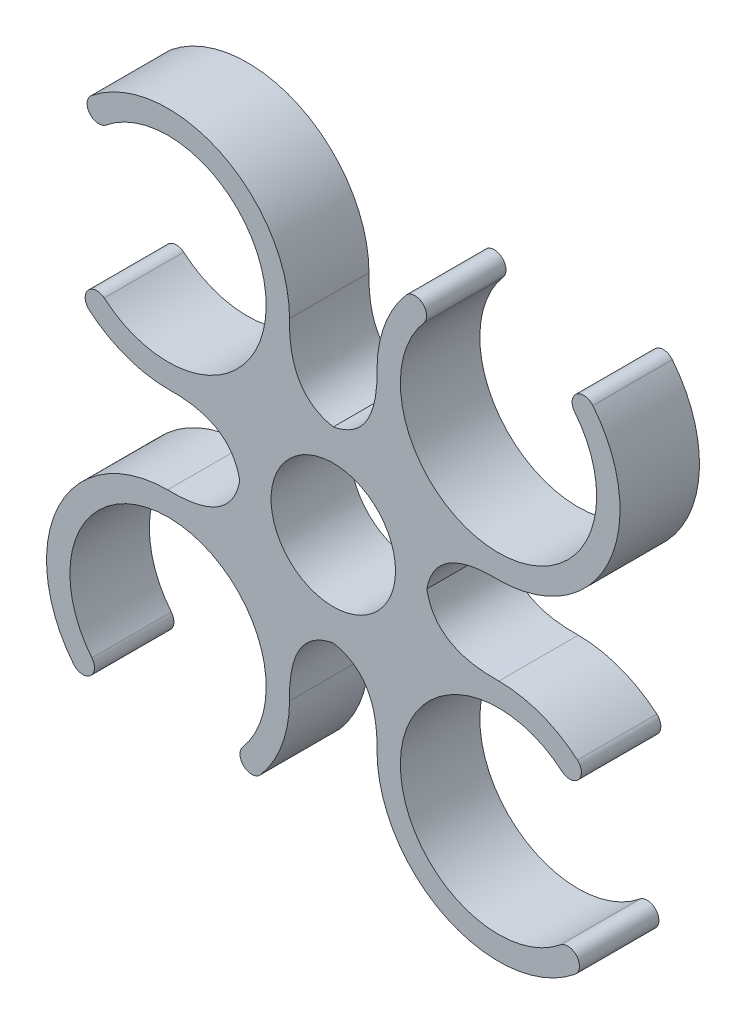
ISO-10303-21;
HEADER;
FILE_DESCRIPTION(('STEP AP214'),'2;1');
FILE_NAME('part.step','',(''),(''),'','','');
FILE_SCHEMA(('AUTOMOTIVE_DESIGN { 1 0 10303 214 1 1 1 1 }'));
ENDSEC;
DATA;
#1=APPLICATION_CONTEXT('core data for automotive mechanical design processes');
#2=APPLICATION_PROTOCOL_DEFINITION('international standard','automotive_design',2000,#1);
#3=PRODUCT_CONTEXT('',#1,'mechanical');
#4=PRODUCT('Part','Part','',(#3));
#5=PRODUCT_RELATED_PRODUCT_CATEGORY('part','',(#4));
#6=PRODUCT_DEFINITION_FORMATION('','',#4);
#7=PRODUCT_DEFINITION_CONTEXT('part definition',#1,'design');
#8=PRODUCT_DEFINITION('design','',#6,#7);
#9=PRODUCT_DEFINITION_SHAPE('','',#8);
#10=(LENGTH_UNIT() NAMED_UNIT(*) SI_UNIT(.MILLI.,.METRE.));
#11=(NAMED_UNIT(*) PLANE_ANGLE_UNIT() SI_UNIT($,.RADIAN.));
#12=(NAMED_UNIT(*) SI_UNIT($,.STERADIAN.) SOLID_ANGLE_UNIT());
#13=UNCERTAINTY_MEASURE_WITH_UNIT(LENGTH_MEASURE(1.E-05),#10,'distance_accuracy_value','');
#14=(GEOMETRIC_REPRESENTATION_CONTEXT(3) GLOBAL_UNCERTAINTY_ASSIGNED_CONTEXT((#13)) GLOBAL_UNIT_ASSIGNED_CONTEXT((#10,
#11,#12)) REPRESENTATION_CONTEXT('',''));
#15=CARTESIAN_POINT('',(0.,0.,0.));
#16=DIRECTION('',(0.,0.,1.));
#17=DIRECTION('',(1.,0.,0.));
#18=AXIS2_PLACEMENT_3D('',#15,#16,#17);
#19=CARTESIAN_POINT('',(-28.7157999497946,42.0002896032631,17.));
#20=DIRECTION('',(0.,0.,1.));
#21=DIRECTION('',(1.,0.,0.));
#22=AXIS2_PLACEMENT_3D('',#19,#20,#21);
#23=PLANE('',#22);
#24=CARTESIAN_POINT('',(-28.7157999497946,42.0002896032631,17.));
#25=DIRECTION('',(0.,0.,-1.));
#26=DIRECTION('',(1.,0.,0.));
#27=AXIS2_PLACEMENT_3D('',#24,#25,#26);
#28=CIRCLE('',#27,21.0000109295997);
#29=CARTESIAN_POINT('',(-41.970273906066,58.2889168991966,17.));
#30=VERTEX_POINT('',#29);
#31=CARTESIAN_POINT('',(-42.3689498491305,26.04435162176,17.));
#32=VERTEX_POINT('',#31);
#33=EDGE_CURVE('E154',#30,#32,#28,.T.);
#34=ORIENTED_EDGE('',*,*,#33,.T.);
#35=CARTESIAN_POINT('',(-43.9425329497987,24.1006773923868,17.));
#36=DIRECTION('',(0.,0.,1.));
#37=DIRECTION('',(-1.,0.,0.));
#38=AXIS2_PLACEMENT_3D('',#35,#36,#37);
#39=CIRCLE('',#38,2.50080652683053);
#40=CARTESIAN_POINT('',(-45.5981989573738,22.2264299818249,17.));
#41=VERTEX_POINT('',#40);
#42=EDGE_CURVE('E623',#32,#41,#39,.T.);
#43=ORIENTED_EDGE('',*,*,#42,.T.);
#44=CARTESIAN_POINT('',(-28.7157999497946,42.0002896032631,17.));
#45=DIRECTION('',(0.,0.,1.));
#46=DIRECTION('',(-1.,0.,0.));
#47=AXIS2_PLACEMENT_3D('',#44,#45,#46);
#48=CIRCLE('',#47,26.0004023157231);
#49=CARTESIAN_POINT('',(-28.7961970319889,16.0000115876605,17.));
#50=VERTEX_POINT('',#49);
#51=EDGE_CURVE('E428',#41,#50,#48,.T.);
#52=ORIENTED_EDGE('',*,*,#51,.T.);
#53=CARTESIAN_POINT('',(-28.7961970319889,16.0000115876605,17.));
#54=CARTESIAN_POINT('',(-15.2077646952023,16.3192303259778,17.));
#55=CARTESIAN_POINT('',(-13.3737129786052,6.64206558705883,17.));
#56=B_SPLINE_CURVE_WITH_KNOTS('',2,(#53,#54,#55),.UNSPECIFIED.,.F.,.F.,(3,3),(0.,1.),.UNSPECIFIED.);
#57=CARTESIAN_POINT('',(-13.3737129786052,6.64206558705883,17.));
#58=VERTEX_POINT('',#57);
#59=EDGE_CURVE('E447',#50,#58,#56,.T.);
#60=ORIENTED_EDGE('',*,*,#59,.T.);
#61=CARTESIAN_POINT('',(-13.3737129786052,6.64206558705883,17.));
#62=CARTESIAN_POINT('',(-15.2076920262172,-3.03511292406953,17.));
#63=CARTESIAN_POINT('',(-28.796126759737,-2.71599622565595,17.));
#64=B_SPLINE_CURVE_WITH_KNOTS('',2,(#61,#62,#63),.UNSPECIFIED.,.F.,.F.,(3,3),(0.,1.),.UNSPECIFIED.);
#65=CARTESIAN_POINT('',(-28.7961267597367,-2.71599622565635,17.));
#66=VERTEX_POINT('',#65);
#67=EDGE_CURVE('E444',#58,#66,#64,.T.);
#68=ORIENTED_EDGE('',*,*,#67,.T.);
#69=CARTESIAN_POINT('',(-28.7162486759378,-28.7157883621349,17.));
#70=DIRECTION('',(0.,0.,1.));
#71=DIRECTION('',(1.,0.,0.));
#72=AXIS2_PLACEMENT_3D('',#69,#70,#71);
#73=CIRCLE('',#72,25.9999148392521);
#74=CARTESIAN_POINT('',(-48.8992484305323,-45.1060931962252,17.));
#75=VERTEX_POINT('',#74);
#76=EDGE_CURVE('E446',#66,#75,#73,.T.);
#77=ORIENTED_EDGE('',*,*,#76,.T.);
#78=CARTESIAN_POINT('',(-46.9585486449202,-43.5301222757684,17.));
#79=DIRECTION('',(0.,0.,1.));
#80=DIRECTION('',(-1.,0.,0.));
#81=AXIS2_PLACEMENT_3D('',#78,#79,#80);
#82=CIRCLE('',#81,2.5);
#83=CARTESIAN_POINT('',(-45.0048759718712,-41.9702623184064,17.));
#84=VERTEX_POINT('',#83);
#85=EDGE_CURVE('E449',#75,#84,#82,.T.);
#86=ORIENTED_EDGE('',*,*,#85,.T.);
#87=CARTESIAN_POINT('',(-28.7162486759378,-28.7157883621349,17.));
#88=DIRECTION('',(0.,0.,-1.));
#89=DIRECTION('',(1.,0.,0.));
#90=AXIS2_PLACEMENT_3D('',#87,#88,#89);
#91=CIRCLE('',#90,21.0000109295997);
#92=CARTESIAN_POINT('',(-12.7603106944351,-42.3689382614704,17.));
#93=VERTEX_POINT('',#92);
#94=EDGE_CURVE('E867',#84,#93,#91,.T.);
#95=ORIENTED_EDGE('',*,*,#94,.T.);
#96=CARTESIAN_POINT('',(-10.8166364650618,-43.9425213621386,17.));
#97=DIRECTION('',(0.,0.,1.));
#98=DIRECTION('',(-1.,0.,0.));
#99=AXIS2_PLACEMENT_3D('',#96,#97,#98);
#100=CIRCLE('',#99,2.50080652683053);
#101=CARTESIAN_POINT('',(-8.94238905449951,-45.5981873697141,17.));
#102=VERTEX_POINT('',#101);
#103=EDGE_CURVE('E864',#93,#102,#100,.T.);
#104=ORIENTED_EDGE('',*,*,#103,.T.);
#105=CARTESIAN_POINT('',(-28.7162486759378,-28.7157883621349,17.));
#106=DIRECTION('',(0.,0.,1.));
#107=DIRECTION('',(-1.,0.,0.));
#108=AXIS2_PLACEMENT_3D('',#105,#106,#107);
#109=CIRCLE('',#108,26.0004023157231);
#110=CARTESIAN_POINT('',(-2.71597066033554,-28.7961854443288,17.));
#111=VERTEX_POINT('',#110);
#112=EDGE_CURVE('E866',#102,#111,#109,.T.);
#113=ORIENTED_EDGE('',*,*,#112,.T.);
#114=CARTESIAN_POINT('',(-2.71597066033554,-28.7961854443288,17.));
#115=CARTESIAN_POINT('',(-3.0351893986527,-15.2077531075425,17.));
#116=CARTESIAN_POINT('',(6.6419753402659,-13.3737013909456,17.));
#117=B_SPLINE_CURVE_WITH_KNOTS('',2,(#114,#115,#116),.UNSPECIFIED.,.F.,.F.,(3,3),(0.,1.),.UNSPECIFIED.);
#118=CARTESIAN_POINT('',(6.6419753402659,-13.3737013909456,17.));
#119=VERTEX_POINT('',#118);
#120=EDGE_CURVE('E577',#111,#119,#117,.T.);
#121=ORIENTED_EDGE('',*,*,#120,.T.);
#122=CARTESIAN_POINT('',(6.6419753402659,-13.3737013909456,17.));
#123=CARTESIAN_POINT('',(16.319153851395,-15.2076804385558,17.));
#124=CARTESIAN_POINT('',(16.0000371529809,-28.7961151720769,17.));
#125=B_SPLINE_CURVE_WITH_KNOTS('',2,(#122,#123,#124),.UNSPECIFIED.,.F.,.F.,(3,3),(0.,1.),.UNSPECIFIED.);
#126=CARTESIAN_POINT('',(16.0000371529817,-28.7961151720768,17.));
#127=VERTEX_POINT('',#126);
#128=EDGE_CURVE('E571',#119,#127,#125,.T.);
#129=ORIENTED_EDGE('',*,*,#128,.T.);
#130=CARTESIAN_POINT('',(41.9998292894603,-28.7162370882779,17.));
#131=DIRECTION('',(0.,0.,1.));
#132=DIRECTION('',(1.,0.,0.));
#133=AXIS2_PLACEMENT_3D('',#130,#131,#132);
#134=CIRCLE('',#133,25.9999148392521);
#135=CARTESIAN_POINT('',(58.3901341235506,-48.8992368428723,17.));
#136=VERTEX_POINT('',#135);
#137=EDGE_CURVE('E576',#127,#136,#134,.T.);
#138=ORIENTED_EDGE('',*,*,#137,.T.);
#139=CARTESIAN_POINT('',(56.8141632030938,-46.9585370572603,17.));
#140=DIRECTION('',(0.,0.,1.));
#141=DIRECTION('',(-1.,0.,0.));
#142=AXIS2_PLACEMENT_3D('',#139,#140,#141);
#143=CIRCLE('',#142,2.5);
#144=CARTESIAN_POINT('',(55.2543032457318,-45.0048643842112,17.));
#145=VERTEX_POINT('',#144);
#146=EDGE_CURVE('E586',#136,#145,#143,.T.);
#147=ORIENTED_EDGE('',*,*,#146,.T.);
#148=CARTESIAN_POINT('',(41.9998292894603,-28.7162370882779,17.));
#149=DIRECTION('',(0.,0.,-1.));
#150=DIRECTION('',(1.,0.,0.));
#151=AXIS2_PLACEMENT_3D('',#148,#149,#150);
#152=CIRCLE('',#151,21.0000109295997);
#153=CARTESIAN_POINT('',(55.6529791887956,-12.7602991067752,17.));
#154=VERTEX_POINT('',#153);
#155=EDGE_CURVE('E588',#145,#154,#152,.T.);
#156=ORIENTED_EDGE('',*,*,#155,.T.);
#157=CARTESIAN_POINT('',(57.2265622894635,-10.8166248774017,17.));
#158=DIRECTION('',(0.,0.,1.));
#159=DIRECTION('',(-1.,0.,0.));
#160=AXIS2_PLACEMENT_3D('',#157,#158,#159);
#161=CIRCLE('',#160,2.50080652683054);
#162=CARTESIAN_POINT('',(58.8822282970394,-8.94237746683952,17.));
#163=VERTEX_POINT('',#162);
#164=EDGE_CURVE('E590',#154,#163,#161,.T.);
#165=ORIENTED_EDGE('',*,*,#164,.T.);
#166=CARTESIAN_POINT('',(41.9998292894603,-28.7162370882779,17.));
#167=DIRECTION('',(0.,0.,1.));
#168=DIRECTION('',(-1.,0.,0.));
#169=AXIS2_PLACEMENT_3D('',#166,#167,#168);
#170=CIRCLE('',#169,26.0004023157231);
#171=CARTESIAN_POINT('',(42.0802263716538,-2.71595907267545,17.));
#172=VERTEX_POINT('',#171);
#173=EDGE_CURVE('E591',#163,#172,#170,.T.);
#174=ORIENTED_EDGE('',*,*,#173,.T.);
#175=CARTESIAN_POINT('',(42.0802263716538,-2.71595907267545,17.));
#176=CARTESIAN_POINT('',(28.4917940348677,-3.03517781099263,17.));
#177=CARTESIAN_POINT('',(26.6577423182709,6.64198692792578,17.));
#178=B_SPLINE_CURVE_WITH_KNOTS('',2,(#175,#176,#177),.UNSPECIFIED.,.F.,.F.,(3,3),(0.,1.),.UNSPECIFIED.);
#179=CARTESIAN_POINT('',(26.6577423182709,6.64198692792578,17.));
#180=VERTEX_POINT('',#179);
#181=EDGE_CURVE('E523',#172,#180,#178,.T.);
#182=ORIENTED_EDGE('',*,*,#181,.T.);
#183=CARTESIAN_POINT('',(26.6577423182709,6.64198692792578,17.));
#184=CARTESIAN_POINT('',(28.4917213658809,16.3191654390547,17.));
#185=CARTESIAN_POINT('',(42.0801560994019,16.000048740641,17.));
#186=B_SPLINE_CURVE_WITH_KNOTS('',2,(#183,#184,#185),.UNSPECIFIED.,.F.,.F.,(3,3),(0.,1.),.UNSPECIFIED.);
#187=CARTESIAN_POINT('',(42.080156099402,16.0000487406416,17.));
#188=VERTEX_POINT('',#187);
#189=EDGE_CURVE('E518',#180,#188,#186,.T.);
#190=ORIENTED_EDGE('',*,*,#189,.T.);
#191=CARTESIAN_POINT('',(42.000278015603,41.9998408771202,17.));
#192=DIRECTION('',(0.,0.,1.));
#193=DIRECTION('',(1.,0.,0.));
#194=AXIS2_PLACEMENT_3D('',#191,#192,#193);
#195=CIRCLE('',#194,25.9999148392521);
#196=CARTESIAN_POINT('',(62.1832777701973,58.3901457112106,17.));
#197=VERTEX_POINT('',#196);
#198=EDGE_CURVE('E516',#188,#197,#195,.T.);
#199=ORIENTED_EDGE('',*,*,#198,.T.);
#200=CARTESIAN_POINT('',(60.2425779845853,56.8141747907538,17.));
#201=DIRECTION('',(0.,0.,1.));
#202=DIRECTION('',(-1.,0.,0.));
#203=AXIS2_PLACEMENT_3D('',#200,#201,#202);
#204=CIRCLE('',#203,2.5);
#205=CARTESIAN_POINT('',(58.2889053115363,55.2543148333918,17.));
#206=VERTEX_POINT('',#205);
#207=EDGE_CURVE('E514',#197,#206,#204,.T.);
#208=ORIENTED_EDGE('',*,*,#207,.T.);
#209=CARTESIAN_POINT('',(42.000278015603,41.9998408771202,17.));
#210=DIRECTION('',(0.,0.,-1.));
#211=DIRECTION('',(1.,0.,0.));
#212=AXIS2_PLACEMENT_3D('',#209,#210,#211);
#213=CIRCLE('',#212,21.0000109295997);
#214=CARTESIAN_POINT('',(26.0443400341001,55.6529907764556,17.));
#215=VERTEX_POINT('',#214);
#216=EDGE_CURVE('E512',#206,#215,#213,.T.);
#217=ORIENTED_EDGE('',*,*,#216,.T.);
#218=CARTESIAN_POINT('',(24.1006658047267,57.2265738771236,17.));
#219=DIRECTION('',(0.,0.,1.));
#220=DIRECTION('',(-1.,0.,0.));
#221=AXIS2_PLACEMENT_3D('',#218,#219,#220);
#222=CIRCLE('',#221,2.50080652683053);
#223=CARTESIAN_POINT('',(22.2264183941646,58.8822398846992,17.));
#224=VERTEX_POINT('',#223);
#225=EDGE_CURVE('E510',#215,#224,#222,.T.);
#226=ORIENTED_EDGE('',*,*,#225,.T.);
#227=CARTESIAN_POINT('',(42.000278015603,41.9998408771202,17.));
#228=DIRECTION('',(0.,0.,1.));
#229=DIRECTION('',(-1.,0.,0.));
#230=AXIS2_PLACEMENT_3D('',#227,#228,#229);
#231=CIRCLE('',#230,26.0004023157231);
#232=CARTESIAN_POINT('',(16.0000000000004,42.0802379593139,17.));
#233=VERTEX_POINT('',#232);
#234=EDGE_CURVE('E505',#224,#233,#231,.T.);
#235=ORIENTED_EDGE('',*,*,#234,.T.);
#236=CARTESIAN_POINT('',(16.0000000000004,42.0802379593139,17.));
#237=CARTESIAN_POINT('',(16.3192187383176,28.491805622528,17.));
#238=CARTESIAN_POINT('',(6.64205399939909,26.6577539059304,17.));
#239=B_SPLINE_CURVE_WITH_KNOTS('',2,(#236,#237,#238),.UNSPECIFIED.,.F.,.F.,(3,3),(0.,1.),.UNSPECIFIED.);
#240=CARTESIAN_POINT('',(6.64205399939909,26.6577539059304,17.));
#241=VERTEX_POINT('',#240);
#242=EDGE_CURVE('E234',#233,#241,#239,.T.);
#243=ORIENTED_EDGE('',*,*,#242,.T.);
#244=CARTESIAN_POINT('',(6.64205399939909,26.6577539059304,17.));
#245=CARTESIAN_POINT('',(-3.03512451172918,28.4917329535425,17.));
#246=CARTESIAN_POINT('',(-2.71600781331604,42.0801676870619,17.));
#247=B_SPLINE_CURVE_WITH_KNOTS('',2,(#244,#245,#246),.UNSPECIFIED.,.F.,.F.,(3,3),(0.,1.),.UNSPECIFIED.);
#248=CARTESIAN_POINT('',(-2.71600781331604,42.0801676870619,17.));
#249=VERTEX_POINT('',#248);
#250=EDGE_CURVE('E228',#241,#249,#247,.T.);
#251=ORIENTED_EDGE('',*,*,#250,.T.);
#252=CARTESIAN_POINT('',(-28.7157999497946,42.0002896032631,17.));
#253=DIRECTION('',(0.,0.,1.));
#254=DIRECTION('',(1.,0.,0.));
#255=AXIS2_PLACEMENT_3D('',#252,#253,#254);
#256=CIRCLE('',#255,25.9999148392521);
#257=CARTESIAN_POINT('',(-45.1061047838848,62.1832893578577,17.));
#258=VERTEX_POINT('',#257);
#259=EDGE_CURVE('E232',#249,#258,#256,.T.);
#260=ORIENTED_EDGE('',*,*,#259,.T.);
#261=CARTESIAN_POINT('',(-43.530133863428,60.2425895722457,17.));
#262=DIRECTION('',(0.,0.,1.));
#263=DIRECTION('',(-1.,0.,0.));
#264=AXIS2_PLACEMENT_3D('',#261,#262,#263);
#265=CIRCLE('',#264,2.5);
#266=EDGE_CURVE('E52',#258,#30,#265,.T.);
#267=ORIENTED_EDGE('',*,*,#266,.T.);
#268=EDGE_LOOP('',(#34,#43,#52,#60,#68,#77,#86,#95,#104,#113,#121,#129,#138,#147,#156,#165,#174,
#182,#190,#199,#208,#217,#226,#235,#243,#251,#260,#267));
#269=FACE_BOUND('',#268,.T.);
#270=CARTESIAN_POINT('',(6.64201466983242,6.64202625749252,17.));
#271=DIRECTION('',(0.,0.,1.));
#272=DIRECTION('',(1.,0.,0.));
#273=AXIS2_PLACEMENT_3D('',#270,#271,#272);
#274=CIRCLE('',#273,13.3158953189367);
#275=CARTESIAN_POINT('',(19.9579099887691,6.64202625749252,17.));
#276=VERTEX_POINT('',#275);
#277=EDGE_CURVE('E257',#276,#276,#274,.T.);
#278=ORIENTED_EDGE('',*,*,#277,.F.);
#279=EDGE_LOOP('',(#278));
#280=FACE_BOUND('',#279,.T.);
#281=ADVANCED_FACE('F35',(#269,#280),#23,.T.);
#282=CARTESIAN_POINT('',(-28.7157999497946,42.0002896032631,0.));
#283=DIRECTION('',(0.,0.,1.));
#284=DIRECTION('',(1.,0.,0.));
#285=AXIS2_PLACEMENT_3D('',#282,#283,#284);
#286=PLANE('',#285);
#287=CARTESIAN_POINT('',(-28.7157999497946,42.0002896032631,0.));
#288=DIRECTION('',(0.,0.,-1.));
#289=DIRECTION('',(1.,0.,0.));
#290=AXIS2_PLACEMENT_3D('',#287,#288,#289);
#291=CIRCLE('',#290,21.0000109295997);
#292=CARTESIAN_POINT('',(-41.970273906066,58.2889168991966,0.));
#293=VERTEX_POINT('',#292);
#294=CARTESIAN_POINT('',(-42.3689498491305,26.04435162176,0.));
#295=VERTEX_POINT('',#294);
#296=EDGE_CURVE('E148',#293,#295,#291,.T.);
#297=ORIENTED_EDGE('',*,*,#296,.F.);
#298=CARTESIAN_POINT('',(-43.530133863428,60.2425895722457,0.));
#299=DIRECTION('',(0.,0.,1.));
#300=DIRECTION('',(-1.,0.,0.));
#301=AXIS2_PLACEMENT_3D('',#298,#299,#300);
#302=CIRCLE('',#301,2.5);
#303=CARTESIAN_POINT('',(-45.1061047838848,62.1832893578577,0.));
#304=VERTEX_POINT('',#303);
#305=EDGE_CURVE('E350',#304,#293,#302,.T.);
#306=ORIENTED_EDGE('',*,*,#305,.F.);
#307=CARTESIAN_POINT('',(-28.7157999497946,42.0002896032631,0.));
#308=DIRECTION('',(0.,0.,1.));
#309=DIRECTION('',(1.,0.,0.));
#310=AXIS2_PLACEMENT_3D('',#307,#308,#309);
#311=CIRCLE('',#310,25.9999148392521);
#312=CARTESIAN_POINT('',(-2.71600781331604,42.0801676870619,0.));
#313=VERTEX_POINT('',#312);
#314=EDGE_CURVE('E141',#313,#304,#311,.T.);
#315=ORIENTED_EDGE('',*,*,#314,.F.);
#316=CARTESIAN_POINT('',(6.64205399939909,26.6577539059304,0.));
#317=CARTESIAN_POINT('',(-3.03512451172918,28.4917329535425,0.));
#318=CARTESIAN_POINT('',(-2.71600781331604,42.0801676870619,0.));
#319=B_SPLINE_CURVE_WITH_KNOTS('',2,(#316,#317,#318),.UNSPECIFIED.,.F.,.F.,(3,3),(0.,1.),.UNSPECIFIED.);
#320=CARTESIAN_POINT('',(6.64205399939909,26.6577539059304,0.));
#321=VERTEX_POINT('',#320);
#322=EDGE_CURVE('E242',#321,#313,#319,.T.);
#323=ORIENTED_EDGE('',*,*,#322,.F.);
#324=CARTESIAN_POINT('',(16.0000000000004,42.0802379593139,0.));
#325=CARTESIAN_POINT('',(16.3192187383176,28.491805622528,0.));
#326=CARTESIAN_POINT('',(6.64205399939909,26.6577539059304,0.));
#327=B_SPLINE_CURVE_WITH_KNOTS('',2,(#324,#325,#326),.UNSPECIFIED.,.F.,.F.,(3,3),(0.,1.),.UNSPECIFIED.);
#328=CARTESIAN_POINT('',(16.0000000000004,42.0802379593139,0.));
#329=VERTEX_POINT('',#328);
#330=EDGE_CURVE('E336',#329,#321,#327,.T.);
#331=ORIENTED_EDGE('',*,*,#330,.F.);
#332=CARTESIAN_POINT('',(42.000278015603,41.9998408771202,0.));
#333=DIRECTION('',(0.,0.,1.));
#334=DIRECTION('',(-1.,0.,0.));
#335=AXIS2_PLACEMENT_3D('',#332,#333,#334);
#336=CIRCLE('',#335,26.0004023157231);
#337=CARTESIAN_POINT('',(22.2264183941646,58.8822398846992,0.));
#338=VERTEX_POINT('',#337);
#339=EDGE_CURVE('E334',#338,#329,#336,.T.);
#340=ORIENTED_EDGE('',*,*,#339,.F.);
#341=CARTESIAN_POINT('',(24.1006658047267,57.2265738771236,0.));
#342=DIRECTION('',(0.,0.,1.));
#343=DIRECTION('',(-1.,0.,0.));
#344=AXIS2_PLACEMENT_3D('',#341,#342,#343);
#345=CIRCLE('',#344,2.50080652683053);
#346=CARTESIAN_POINT('',(26.0443400341001,55.6529907764556,0.));
#347=VERTEX_POINT('',#346);
#348=EDGE_CURVE('E332',#347,#338,#345,.T.);
#349=ORIENTED_EDGE('',*,*,#348,.F.);
#350=CARTESIAN_POINT('',(42.000278015603,41.9998408771202,0.));
#351=DIRECTION('',(0.,0.,-1.));
#352=DIRECTION('',(1.,0.,0.));
#353=AXIS2_PLACEMENT_3D('',#350,#351,#352);
#354=CIRCLE('',#353,21.0000109295997);
#355=CARTESIAN_POINT('',(58.2889053115363,55.2543148333918,0.));
#356=VERTEX_POINT('',#355);
#357=EDGE_CURVE('E330',#356,#347,#354,.T.);
#358=ORIENTED_EDGE('',*,*,#357,.F.);
#359=CARTESIAN_POINT('',(60.2425779845853,56.8141747907538,0.));
#360=DIRECTION('',(0.,0.,1.));
#361=DIRECTION('',(-1.,0.,0.));
#362=AXIS2_PLACEMENT_3D('',#359,#360,#361);
#363=CIRCLE('',#362,2.5);
#364=CARTESIAN_POINT('',(62.1832777701973,58.3901457112106,0.));
#365=VERTEX_POINT('',#364);
#366=EDGE_CURVE('E327',#365,#356,#363,.T.);
#367=ORIENTED_EDGE('',*,*,#366,.F.);
#368=CARTESIAN_POINT('',(42.000278015603,41.9998408771202,0.));
#369=DIRECTION('',(0.,0.,1.));
#370=DIRECTION('',(1.,0.,0.));
#371=AXIS2_PLACEMENT_3D('',#368,#369,#370);
#372=CIRCLE('',#371,25.9999148392521);
#373=CARTESIAN_POINT('',(42.080156099402,16.0000487406416,0.));
#374=VERTEX_POINT('',#373);
#375=EDGE_CURVE('E322',#374,#365,#372,.T.);
#376=ORIENTED_EDGE('',*,*,#375,.F.);
#377=CARTESIAN_POINT('',(26.6577423182709,6.64198692792578,0.));
#378=CARTESIAN_POINT('',(28.4917213658809,16.3191654390547,0.));
#379=CARTESIAN_POINT('',(42.0801560994019,16.000048740641,0.));
#380=B_SPLINE_CURVE_WITH_KNOTS('',2,(#377,#378,#379),.UNSPECIFIED.,.F.,.F.,(3,3),(0.,1.),.UNSPECIFIED.);
#381=CARTESIAN_POINT('',(26.6577423182709,6.64198692792578,0.));
#382=VERTEX_POINT('',#381);
#383=EDGE_CURVE('E315',#382,#374,#380,.T.);
#384=ORIENTED_EDGE('',*,*,#383,.F.);
#385=CARTESIAN_POINT('',(42.0802263716538,-2.71595907267545,0.));
#386=CARTESIAN_POINT('',(28.4917940348677,-3.03517781099263,0.));
#387=CARTESIAN_POINT('',(26.6577423182709,6.64198692792578,0.));
#388=B_SPLINE_CURVE_WITH_KNOTS('',2,(#385,#386,#387),.UNSPECIFIED.,.F.,.F.,(3,3),(0.,1.),.UNSPECIFIED.);
#389=CARTESIAN_POINT('',(42.0802263716538,-2.71595907267545,0.));
#390=VERTEX_POINT('',#389);
#391=EDGE_CURVE('E311',#390,#382,#388,.T.);
#392=ORIENTED_EDGE('',*,*,#391,.F.);
#393=CARTESIAN_POINT('',(41.9998292894603,-28.7162370882779,0.));
#394=DIRECTION('',(0.,0.,1.));
#395=DIRECTION('',(-1.,0.,0.));
#396=AXIS2_PLACEMENT_3D('',#393,#394,#395);
#397=CIRCLE('',#396,26.0004023157231);
#398=CARTESIAN_POINT('',(58.8822282970394,-8.94237746683952,0.));
#399=VERTEX_POINT('',#398);
#400=EDGE_CURVE('E309',#399,#390,#397,.T.);
#401=ORIENTED_EDGE('',*,*,#400,.F.);
#402=CARTESIAN_POINT('',(57.2265622894635,-10.8166248774017,0.));
#403=DIRECTION('',(0.,0.,1.));
#404=DIRECTION('',(-1.,0.,0.));
#405=AXIS2_PLACEMENT_3D('',#402,#403,#404);
#406=CIRCLE('',#405,2.50080652683054);
#407=CARTESIAN_POINT('',(55.6529791887956,-12.7602991067752,0.));
#408=VERTEX_POINT('',#407);
#409=EDGE_CURVE('E307',#408,#399,#406,.T.);
#410=ORIENTED_EDGE('',*,*,#409,.F.);
#411=CARTESIAN_POINT('',(41.9998292894603,-28.7162370882779,0.));
#412=DIRECTION('',(0.,0.,-1.));
#413=DIRECTION('',(1.,0.,0.));
#414=AXIS2_PLACEMENT_3D('',#411,#412,#413);
#415=CIRCLE('',#414,21.0000109295997);
#416=CARTESIAN_POINT('',(55.2543032457318,-45.0048643842112,0.));
#417=VERTEX_POINT('',#416);
#418=EDGE_CURVE('E305',#417,#408,#415,.T.);
#419=ORIENTED_EDGE('',*,*,#418,.F.);
#420=CARTESIAN_POINT('',(56.8141632030938,-46.9585370572603,0.));
#421=DIRECTION('',(0.,0.,1.));
#422=DIRECTION('',(-1.,0.,0.));
#423=AXIS2_PLACEMENT_3D('',#420,#421,#422);
#424=CIRCLE('',#423,2.5);
#425=CARTESIAN_POINT('',(58.3901341235506,-48.8992368428723,0.));
#426=VERTEX_POINT('',#425);
#427=EDGE_CURVE('E302',#426,#417,#424,.T.);
#428=ORIENTED_EDGE('',*,*,#427,.F.);
#429=CARTESIAN_POINT('',(41.9998292894603,-28.7162370882779,0.));
#430=DIRECTION('',(0.,0.,1.));
#431=DIRECTION('',(1.,0.,0.));
#432=AXIS2_PLACEMENT_3D('',#429,#430,#431);
#433=CIRCLE('',#432,25.9999148392521);
#434=CARTESIAN_POINT('',(16.0000371529817,-28.7961151720768,0.));
#435=VERTEX_POINT('',#434);
#436=EDGE_CURVE('E297',#435,#426,#433,.T.);
#437=ORIENTED_EDGE('',*,*,#436,.F.);
#438=CARTESIAN_POINT('',(6.6419753402659,-13.3737013909456,0.));
#439=CARTESIAN_POINT('',(16.319153851395,-15.2076804385558,0.));
#440=CARTESIAN_POINT('',(16.0000371529809,-28.7961151720769,0.));
#441=B_SPLINE_CURVE_WITH_KNOTS('',2,(#438,#439,#440),.UNSPECIFIED.,.F.,.F.,(3,3),(0.,1.),.UNSPECIFIED.);
#442=CARTESIAN_POINT('',(6.6419753402659,-13.3737013909456,0.));
#443=VERTEX_POINT('',#442);
#444=EDGE_CURVE('E290',#443,#435,#441,.T.);
#445=ORIENTED_EDGE('',*,*,#444,.F.);
#446=CARTESIAN_POINT('',(-2.71597066033554,-28.7961854443288,0.));
#447=CARTESIAN_POINT('',(-3.0351893986527,-15.2077531075425,0.));
#448=CARTESIAN_POINT('',(6.6419753402659,-13.3737013909456,0.));
#449=B_SPLINE_CURVE_WITH_KNOTS('',2,(#446,#447,#448),.UNSPECIFIED.,.F.,.F.,(3,3),(0.,1.),.UNSPECIFIED.);
#450=CARTESIAN_POINT('',(-2.71597066033554,-28.7961854443288,0.));
#451=VERTEX_POINT('',#450);
#452=EDGE_CURVE('E286',#451,#443,#449,.T.);
#453=ORIENTED_EDGE('',*,*,#452,.F.);
#454=CARTESIAN_POINT('',(-28.7162486759378,-28.7157883621349,0.));
#455=DIRECTION('',(0.,0.,1.));
#456=DIRECTION('',(-1.,0.,0.));
#457=AXIS2_PLACEMENT_3D('',#454,#455,#456);
#458=CIRCLE('',#457,26.0004023157231);
#459=CARTESIAN_POINT('',(-8.94238905449951,-45.5981873697141,0.));
#460=VERTEX_POINT('',#459);
#461=EDGE_CURVE('E284',#460,#451,#458,.T.);
#462=ORIENTED_EDGE('',*,*,#461,.F.);
#463=CARTESIAN_POINT('',(-10.8166364650618,-43.9425213621386,0.));
#464=DIRECTION('',(0.,0.,1.));
#465=DIRECTION('',(-1.,0.,0.));
#466=AXIS2_PLACEMENT_3D('',#463,#464,#465);
#467=CIRCLE('',#466,2.50080652683053);
#468=CARTESIAN_POINT('',(-12.7603106944351,-42.3689382614704,0.));
#469=VERTEX_POINT('',#468);
#470=EDGE_CURVE('E282',#469,#460,#467,.T.);
#471=ORIENTED_EDGE('',*,*,#470,.F.);
#472=CARTESIAN_POINT('',(-28.7162486759378,-28.7157883621349,0.));
#473=DIRECTION('',(0.,0.,-1.));
#474=DIRECTION('',(1.,0.,0.));
#475=AXIS2_PLACEMENT_3D('',#472,#473,#474);
#476=CIRCLE('',#475,21.0000109295997);
#477=CARTESIAN_POINT('',(-45.0048759718712,-41.9702623184064,0.));
#478=VERTEX_POINT('',#477);
#479=EDGE_CURVE('E280',#478,#469,#476,.T.);
#480=ORIENTED_EDGE('',*,*,#479,.F.);
#481=CARTESIAN_POINT('',(-46.9585486449202,-43.5301222757684,0.));
#482=DIRECTION('',(0.,0.,1.));
#483=DIRECTION('',(-1.,0.,0.));
#484=AXIS2_PLACEMENT_3D('',#481,#482,#483);
#485=CIRCLE('',#484,2.5);
#486=CARTESIAN_POINT('',(-48.8992484305323,-45.1060931962252,0.));
#487=VERTEX_POINT('',#486);
#488=EDGE_CURVE('E277',#487,#478,#485,.T.);
#489=ORIENTED_EDGE('',*,*,#488,.F.);
#490=CARTESIAN_POINT('',(-28.7162486759378,-28.7157883621349,0.));
#491=DIRECTION('',(0.,0.,1.));
#492=DIRECTION('',(1.,0.,0.));
#493=AXIS2_PLACEMENT_3D('',#490,#491,#492);
#494=CIRCLE('',#493,25.9999148392521);
#495=CARTESIAN_POINT('',(-28.7961267597367,-2.71599622565635,0.));
#496=VERTEX_POINT('',#495);
#497=EDGE_CURVE('E272',#496,#487,#494,.T.);
#498=ORIENTED_EDGE('',*,*,#497,.F.);
#499=CARTESIAN_POINT('',(-13.3737129786052,6.64206558705883,0.));
#500=CARTESIAN_POINT('',(-15.2076920262172,-3.03511292406953,0.));
#501=CARTESIAN_POINT('',(-28.796126759737,-2.71599622565595,0.));
#502=B_SPLINE_CURVE_WITH_KNOTS('',2,(#499,#500,#501),.UNSPECIFIED.,.F.,.F.,(3,3),(0.,1.),.UNSPECIFIED.);
#503=CARTESIAN_POINT('',(-13.3737129786052,6.64206558705883,0.));
#504=VERTEX_POINT('',#503);
#505=EDGE_CURVE('E265',#504,#496,#502,.T.);
#506=ORIENTED_EDGE('',*,*,#505,.F.);
#507=CARTESIAN_POINT('',(-28.7961970319889,16.0000115876605,0.));
#508=CARTESIAN_POINT('',(-15.2077646952023,16.3192303259778,0.));
#509=CARTESIAN_POINT('',(-13.3737129786052,6.64206558705883,0.));
#510=B_SPLINE_CURVE_WITH_KNOTS('',2,(#507,#508,#509),.UNSPECIFIED.,.F.,.F.,(3,3),(0.,1.),.UNSPECIFIED.);
#511=CARTESIAN_POINT('',(-28.7961970319889,16.0000115876605,0.));
#512=VERTEX_POINT('',#511);
#513=EDGE_CURVE('E261',#512,#504,#510,.T.);
#514=ORIENTED_EDGE('',*,*,#513,.F.);
#515=CARTESIAN_POINT('',(-28.7157999497946,42.0002896032631,0.));
#516=DIRECTION('',(0.,0.,1.));
#517=DIRECTION('',(-1.,0.,0.));
#518=AXIS2_PLACEMENT_3D('',#515,#516,#517);
#519=CIRCLE('',#518,26.0004023157231);
#520=CARTESIAN_POINT('',(-45.5981989573738,22.2264299818249,0.));
#521=VERTEX_POINT('',#520);
#522=EDGE_CURVE('E259',#521,#512,#519,.T.);
#523=ORIENTED_EDGE('',*,*,#522,.F.);
#524=CARTESIAN_POINT('',(-43.9425329497987,24.1006773923868,0.));
#525=DIRECTION('',(0.,0.,1.));
#526=DIRECTION('',(-1.,0.,0.));
#527=AXIS2_PLACEMENT_3D('',#524,#525,#526);
#528=CIRCLE('',#527,2.50080652683053);
#529=EDGE_CURVE('E256',#295,#521,#528,.T.);
#530=ORIENTED_EDGE('',*,*,#529,.F.);
#531=EDGE_LOOP('',(#297,#306,#315,#323,#331,#340,#349,#358,#367,#376,#384,#392,#401,#410,#419,
#428,#437,#445,#453,#462,#471,#480,#489,#498,#506,#514,#523,#530));
#532=FACE_BOUND('',#531,.T.);
#533=CARTESIAN_POINT('',(6.64201466983242,6.64202625749252,0.));
#534=DIRECTION('',(0.,0.,1.));
#535=DIRECTION('',(1.,0.,0.));
#536=AXIS2_PLACEMENT_3D('',#533,#534,#535);
#537=CIRCLE('',#536,13.3158953189367);
#538=CARTESIAN_POINT('',(19.9579099887691,6.64202625749252,0.));
#539=VERTEX_POINT('',#538);
#540=EDGE_CURVE('E627',#539,#539,#537,.T.);
#541=ORIENTED_EDGE('',*,*,#540,.T.);
#542=EDGE_LOOP('',(#541));
#543=FACE_BOUND('',#542,.T.);
#544=ADVANCED_FACE('F432',(#532,#543),#286,.F.);
#545=CARTESIAN_POINT('',(-28.7157999497946,42.0002896032631,17.));
#546=DIRECTION('',(0.,0.,-1.));
#547=DIRECTION('',(-1.,0.,0.));
#548=AXIS2_PLACEMENT_3D('',#545,#546,#547);
#549=CYLINDRICAL_SURFACE('',#548,21.0000109295997);
#550=ORIENTED_EDGE('',*,*,#296,.T.);
#551=DIRECTION('',(0.,0.,-1.));
#552=VECTOR('',#551,1.);
#553=CARTESIAN_POINT('',(-42.3689498491305,26.04435162176,17.));
#554=LINE('',#553,#552);
#555=EDGE_CURVE('E11',#32,#295,#554,.T.);
#556=ORIENTED_EDGE('',*,*,#555,.F.);
#557=ORIENTED_EDGE('',*,*,#33,.F.);
#558=DIRECTION('',(0.,0.,-1.));
#559=VECTOR('',#558,1.);
#560=CARTESIAN_POINT('',(-41.970273906066,58.2889168991966,17.));
#561=LINE('',#560,#559);
#562=EDGE_CURVE('E248',#30,#293,#561,.T.);
#563=ORIENTED_EDGE('',*,*,#562,.T.);
#564=EDGE_LOOP('',(#550,#556,#557,#563));
#565=FACE_BOUND('',#564,.T.);
#566=ADVANCED_FACE('F37',(#565),#549,.F.);
#567=CARTESIAN_POINT('',(-43.9425329497987,24.1006773923868,17.));
#568=DIRECTION('',(0.,0.,-1.));
#569=DIRECTION('',(-1.,0.,0.));
#570=AXIS2_PLACEMENT_3D('',#567,#568,#569);
#571=CYLINDRICAL_SURFACE('',#570,2.50080652683053);
#572=ORIENTED_EDGE('',*,*,#529,.T.);
#573=DIRECTION('',(0.,0.,-1.));
#574=VECTOR('',#573,1.);
#575=CARTESIAN_POINT('',(-45.5981989573738,22.2264299818249,17.));
#576=LINE('',#575,#574);
#577=EDGE_CURVE('E44',#41,#521,#576,.T.);
#578=ORIENTED_EDGE('',*,*,#577,.F.);
#579=ORIENTED_EDGE('',*,*,#42,.F.);
#580=ORIENTED_EDGE('',*,*,#555,.T.);
#581=EDGE_LOOP('',(#572,#578,#579,#580));
#582=FACE_BOUND('',#581,.T.);
#583=ADVANCED_FACE('F472',(#582),#571,.T.);
#584=CARTESIAN_POINT('',(-28.7157999497946,42.0002896032631,17.));
#585=DIRECTION('',(0.,0.,-1.));
#586=DIRECTION('',(-1.,0.,0.));
#587=AXIS2_PLACEMENT_3D('',#584,#585,#586);
#588=CYLINDRICAL_SURFACE('',#587,26.0004023157231);
#589=ORIENTED_EDGE('',*,*,#522,.T.);
#590=DIRECTION('',(0.,0.,-1.));
#591=VECTOR('',#590,1.);
#592=CARTESIAN_POINT('',(-28.7961970319889,16.0000115876605,17.));
#593=LINE('',#592,#591);
#594=EDGE_CURVE('E419',#50,#512,#593,.T.);
#595=ORIENTED_EDGE('',*,*,#594,.F.);
#596=ORIENTED_EDGE('',*,*,#51,.F.);
#597=ORIENTED_EDGE('',*,*,#577,.T.);
#598=EDGE_LOOP('',(#589,#595,#596,#597));
#599=FACE_BOUND('',#598,.T.);
#600=ADVANCED_FACE('F426',(#599),#588,.T.);
#601=DIRECTION('',(0.,0.,-1.));
#602=VECTOR('',#601,1.);
#603=SURFACE_OF_LINEAR_EXTRUSION('',#56,#602);
#604=ORIENTED_EDGE('',*,*,#513,.T.);
#605=DIRECTION('',(0.,0.,-1.));
#606=VECTOR('',#605,1.);
#607=CARTESIAN_POINT('',(-13.3737129786052,6.64206558705883,17.));
#608=LINE('',#607,#606);
#609=EDGE_CURVE('E416',#58,#504,#608,.T.);
#610=ORIENTED_EDGE('',*,*,#609,.F.);
#611=ORIENTED_EDGE('',*,*,#59,.F.);
#612=ORIENTED_EDGE('',*,*,#594,.T.);
#613=EDGE_LOOP('',(#604,#610,#611,#612));
#614=FACE_BOUND('',#613,.T.);
#615=ADVANCED_FACE('F438',(#614),#603,.F.);
#616=DIRECTION('',(0.,0.,-1.));
#617=VECTOR('',#616,1.);
#618=SURFACE_OF_LINEAR_EXTRUSION('',#64,#617);
#619=ORIENTED_EDGE('',*,*,#505,.T.);
#620=DIRECTION('',(0.,0.,-1.));
#621=VECTOR('',#620,1.);
#622=CARTESIAN_POINT('',(-28.7961267597367,-2.71599622565635,17.));
#623=LINE('',#622,#621);
#624=EDGE_CURVE('E413',#66,#496,#623,.T.);
#625=ORIENTED_EDGE('',*,*,#624,.F.);
#626=ORIENTED_EDGE('',*,*,#67,.F.);
#627=ORIENTED_EDGE('',*,*,#609,.T.);
#628=EDGE_LOOP('',(#619,#625,#626,#627));
#629=FACE_BOUND('',#628,.T.);
#630=ADVANCED_FACE('F442',(#629),#618,.F.);
#631=CARTESIAN_POINT('',(-28.7162486759378,-28.7157883621349,17.));
#632=DIRECTION('',(0.,0.,-1.));
#633=DIRECTION('',(-1.,0.,0.));
#634=AXIS2_PLACEMENT_3D('',#631,#632,#633);
#635=CYLINDRICAL_SURFACE('',#634,25.9999148392521);
#636=ORIENTED_EDGE('',*,*,#497,.T.);
#637=DIRECTION('',(0.,0.,-1.));
#638=VECTOR('',#637,1.);
#639=CARTESIAN_POINT('',(-48.8992484305323,-45.1060931962252,17.));
#640=LINE('',#639,#638);
#641=EDGE_CURVE('E410',#75,#487,#640,.T.);
#642=ORIENTED_EDGE('',*,*,#641,.F.);
#643=ORIENTED_EDGE('',*,*,#76,.F.);
#644=ORIENTED_EDGE('',*,*,#624,.T.);
#645=EDGE_LOOP('',(#636,#642,#643,#644));
#646=FACE_BOUND('',#645,.T.);
#647=ADVANCED_FACE('F467',(#646),#635,.T.);
#648=CARTESIAN_POINT('',(-46.9585486449202,-43.5301222757684,17.));
#649=DIRECTION('',(0.,0.,-1.));
#650=DIRECTION('',(-1.,0.,0.));
#651=AXIS2_PLACEMENT_3D('',#648,#649,#650);
#652=CYLINDRICAL_SURFACE('',#651,2.5);
#653=ORIENTED_EDGE('',*,*,#488,.T.);
#654=DIRECTION('',(0.,0.,-1.));
#655=VECTOR('',#654,1.);
#656=CARTESIAN_POINT('',(-45.0048759718712,-41.9702623184064,17.));
#657=LINE('',#656,#655);
#658=EDGE_CURVE('E407',#84,#478,#657,.T.);
#659=ORIENTED_EDGE('',*,*,#658,.F.);
#660=ORIENTED_EDGE('',*,*,#85,.F.);
#661=ORIENTED_EDGE('',*,*,#641,.T.);
#662=EDGE_LOOP('',(#653,#659,#660,#661));
#663=FACE_BOUND('',#662,.T.);
#664=ADVANCED_FACE('F740',(#663),#652,.T.);
#665=CARTESIAN_POINT('',(-28.7162486759378,-28.7157883621349,17.));
#666=DIRECTION('',(0.,0.,-1.));
#667=DIRECTION('',(-1.,0.,0.));
#668=AXIS2_PLACEMENT_3D('',#665,#666,#667);
#669=CYLINDRICAL_SURFACE('',#668,21.0000109295997);
#670=ORIENTED_EDGE('',*,*,#479,.T.);
#671=DIRECTION('',(0.,0.,-1.));
#672=VECTOR('',#671,1.);
#673=CARTESIAN_POINT('',(-12.7603106944351,-42.3689382614704,17.));
#674=LINE('',#673,#672);
#675=EDGE_CURVE('E404',#93,#469,#674,.T.);
#676=ORIENTED_EDGE('',*,*,#675,.F.);
#677=ORIENTED_EDGE('',*,*,#94,.F.);
#678=ORIENTED_EDGE('',*,*,#658,.T.);
#679=EDGE_LOOP('',(#670,#676,#677,#678));
#680=FACE_BOUND('',#679,.T.);
#681=ADVANCED_FACE('F732',(#680),#669,.F.);
#682=CARTESIAN_POINT('',(-10.8166364650618,-43.9425213621386,17.));
#683=DIRECTION('',(0.,0.,-1.));
#684=DIRECTION('',(-1.,0.,0.));
#685=AXIS2_PLACEMENT_3D('',#682,#683,#684);
#686=CYLINDRICAL_SURFACE('',#685,2.50080652683053);
#687=ORIENTED_EDGE('',*,*,#470,.T.);
#688=DIRECTION('',(0.,0.,-1.));
#689=VECTOR('',#688,1.);
#690=CARTESIAN_POINT('',(-8.94238905449951,-45.5981873697141,17.));
#691=LINE('',#690,#689);
#692=EDGE_CURVE('E401',#102,#460,#691,.T.);
#693=ORIENTED_EDGE('',*,*,#692,.F.);
#694=ORIENTED_EDGE('',*,*,#103,.F.);
#695=ORIENTED_EDGE('',*,*,#675,.T.);
#696=EDGE_LOOP('',(#687,#693,#694,#695));
#697=FACE_BOUND('',#696,.T.);
#698=ADVANCED_FACE('F725',(#697),#686,.T.);
#699=CARTESIAN_POINT('',(-28.7162486759378,-28.7157883621349,17.));
#700=DIRECTION('',(0.,0.,-1.));
#701=DIRECTION('',(-1.,0.,0.));
#702=AXIS2_PLACEMENT_3D('',#699,#700,#701);
#703=CYLINDRICAL_SURFACE('',#702,26.0004023157231);
#704=ORIENTED_EDGE('',*,*,#461,.T.);
#705=DIRECTION('',(0.,0.,-1.));
#706=VECTOR('',#705,1.);
#707=CARTESIAN_POINT('',(-2.71597066033554,-28.7961854443288,17.));
#708=LINE('',#707,#706);
#709=EDGE_CURVE('E398',#111,#451,#708,.T.);
#710=ORIENTED_EDGE('',*,*,#709,.F.);
#711=ORIENTED_EDGE('',*,*,#112,.F.);
#712=ORIENTED_EDGE('',*,*,#692,.T.);
#713=EDGE_LOOP('',(#704,#710,#711,#712));
#714=FACE_BOUND('',#713,.T.);
#715=ADVANCED_FACE('F718',(#714),#703,.T.);
#716=DIRECTION('',(0.,0.,-1.));
#717=VECTOR('',#716,1.);
#718=SURFACE_OF_LINEAR_EXTRUSION('',#117,#717);
#719=ORIENTED_EDGE('',*,*,#452,.T.);
#720=DIRECTION('',(0.,0.,-1.));
#721=VECTOR('',#720,1.);
#722=CARTESIAN_POINT('',(6.6419753402659,-13.3737013909456,17.));
#723=LINE('',#722,#721);
#724=EDGE_CURVE('E395',#119,#443,#723,.T.);
#725=ORIENTED_EDGE('',*,*,#724,.F.);
#726=ORIENTED_EDGE('',*,*,#120,.F.);
#727=ORIENTED_EDGE('',*,*,#709,.T.);
#728=EDGE_LOOP('',(#719,#725,#726,#727));
#729=FACE_BOUND('',#728,.T.);
#730=ADVANCED_FACE('F567',(#729),#718,.F.);
#731=DIRECTION('',(0.,0.,-1.));
#732=VECTOR('',#731,1.);
#733=SURFACE_OF_LINEAR_EXTRUSION('',#125,#732);
#734=ORIENTED_EDGE('',*,*,#444,.T.);
#735=DIRECTION('',(0.,0.,-1.));
#736=VECTOR('',#735,1.);
#737=CARTESIAN_POINT('',(16.0000371529817,-28.7961151720768,17.));
#738=LINE('',#737,#736);
#739=EDGE_CURVE('E392',#127,#435,#738,.T.);
#740=ORIENTED_EDGE('',*,*,#739,.F.);
#741=ORIENTED_EDGE('',*,*,#128,.F.);
#742=ORIENTED_EDGE('',*,*,#724,.T.);
#743=EDGE_LOOP('',(#734,#740,#741,#742));
#744=FACE_BOUND('',#743,.T.);
#745=ADVANCED_FACE('F562',(#744),#733,.F.);
#746=CARTESIAN_POINT('',(41.9998292894603,-28.7162370882779,17.));
#747=DIRECTION('',(0.,0.,-1.));
#748=DIRECTION('',(-1.,0.,0.));
#749=AXIS2_PLACEMENT_3D('',#746,#747,#748);
#750=CYLINDRICAL_SURFACE('',#749,25.9999148392521);
#751=ORIENTED_EDGE('',*,*,#436,.T.);
#752=DIRECTION('',(0.,0.,-1.));
#753=VECTOR('',#752,1.);
#754=CARTESIAN_POINT('',(58.3901341235506,-48.8992368428723,17.));
#755=LINE('',#754,#753);
#756=EDGE_CURVE('E389',#136,#426,#755,.T.);
#757=ORIENTED_EDGE('',*,*,#756,.F.);
#758=ORIENTED_EDGE('',*,*,#137,.F.);
#759=ORIENTED_EDGE('',*,*,#739,.T.);
#760=EDGE_LOOP('',(#751,#757,#758,#759));
#761=FACE_BOUND('',#760,.T.);
#762=ADVANCED_FACE('F558',(#761),#750,.T.);
#763=CARTESIAN_POINT('',(56.8141632030938,-46.9585370572603,17.));
#764=DIRECTION('',(0.,0.,-1.));
#765=DIRECTION('',(-1.,0.,0.));
#766=AXIS2_PLACEMENT_3D('',#763,#764,#765);
#767=CYLINDRICAL_SURFACE('',#766,2.5);
#768=ORIENTED_EDGE('',*,*,#427,.T.);
#769=DIRECTION('',(0.,0.,-1.));
#770=VECTOR('',#769,1.);
#771=CARTESIAN_POINT('',(55.2543032457318,-45.0048643842112,17.));
#772=LINE('',#771,#770);
#773=EDGE_CURVE('E386',#145,#417,#772,.T.);
#774=ORIENTED_EDGE('',*,*,#773,.F.);
#775=ORIENTED_EDGE('',*,*,#146,.F.);
#776=ORIENTED_EDGE('',*,*,#756,.T.);
#777=EDGE_LOOP('',(#768,#774,#775,#776));
#778=FACE_BOUND('',#777,.T.);
#779=ADVANCED_FACE('F554',(#778),#767,.T.);
#780=CARTESIAN_POINT('',(41.9998292894603,-28.7162370882779,17.));
#781=DIRECTION('',(0.,0.,-1.));
#782=DIRECTION('',(-1.,0.,0.));
#783=AXIS2_PLACEMENT_3D('',#780,#781,#782);
#784=CYLINDRICAL_SURFACE('',#783,21.0000109295997);
#785=ORIENTED_EDGE('',*,*,#418,.T.);
#786=DIRECTION('',(0.,0.,-1.));
#787=VECTOR('',#786,1.);
#788=CARTESIAN_POINT('',(55.6529791887956,-12.7602991067752,17.));
#789=LINE('',#788,#787);
#790=EDGE_CURVE('E383',#154,#408,#789,.T.);
#791=ORIENTED_EDGE('',*,*,#790,.F.);
#792=ORIENTED_EDGE('',*,*,#155,.F.);
#793=ORIENTED_EDGE('',*,*,#773,.T.);
#794=EDGE_LOOP('',(#785,#791,#792,#793));
#795=FACE_BOUND('',#794,.T.);
#796=ADVANCED_FACE('F550',(#795),#784,.F.);
#797=CARTESIAN_POINT('',(57.2265622894635,-10.8166248774017,17.));
#798=DIRECTION('',(0.,0.,-1.));
#799=DIRECTION('',(-1.,0.,0.));
#800=AXIS2_PLACEMENT_3D('',#797,#798,#799);
#801=CYLINDRICAL_SURFACE('',#800,2.50080652683054);
#802=ORIENTED_EDGE('',*,*,#409,.T.);
#803=DIRECTION('',(0.,0.,-1.));
#804=VECTOR('',#803,1.);
#805=CARTESIAN_POINT('',(58.8822282970394,-8.94237746683952,17.));
#806=LINE('',#805,#804);
#807=EDGE_CURVE('E380',#163,#399,#806,.T.);
#808=ORIENTED_EDGE('',*,*,#807,.F.);
#809=ORIENTED_EDGE('',*,*,#164,.F.);
#810=ORIENTED_EDGE('',*,*,#790,.T.);
#811=EDGE_LOOP('',(#802,#808,#809,#810));
#812=FACE_BOUND('',#811,.T.);
#813=ADVANCED_FACE('F546',(#812),#801,.T.);
#814=CARTESIAN_POINT('',(41.9998292894603,-28.7162370882779,17.));
#815=DIRECTION('',(0.,0.,-1.));
#816=DIRECTION('',(-1.,0.,0.));
#817=AXIS2_PLACEMENT_3D('',#814,#815,#816);
#818=CYLINDRICAL_SURFACE('',#817,26.0004023157231);
#819=ORIENTED_EDGE('',*,*,#400,.T.);
#820=DIRECTION('',(0.,0.,-1.));
#821=VECTOR('',#820,1.);
#822=CARTESIAN_POINT('',(42.0802263716538,-2.71595907267545,17.));
#823=LINE('',#822,#821);
#824=EDGE_CURVE('E377',#172,#390,#823,.T.);
#825=ORIENTED_EDGE('',*,*,#824,.F.);
#826=ORIENTED_EDGE('',*,*,#173,.F.);
#827=ORIENTED_EDGE('',*,*,#807,.T.);
#828=EDGE_LOOP('',(#819,#825,#826,#827));
#829=FACE_BOUND('',#828,.T.);
#830=ADVANCED_FACE('F542',(#829),#818,.T.);
#831=DIRECTION('',(0.,0.,-1.));
#832=VECTOR('',#831,1.);
#833=SURFACE_OF_LINEAR_EXTRUSION('',#178,#832);
#834=ORIENTED_EDGE('',*,*,#391,.T.);
#835=DIRECTION('',(0.,0.,-1.));
#836=VECTOR('',#835,1.);
#837=CARTESIAN_POINT('',(26.6577423182709,6.64198692792578,17.));
#838=LINE('',#837,#836);
#839=EDGE_CURVE('E374',#180,#382,#838,.T.);
#840=ORIENTED_EDGE('',*,*,#839,.F.);
#841=ORIENTED_EDGE('',*,*,#181,.F.);
#842=ORIENTED_EDGE('',*,*,#824,.T.);
#843=EDGE_LOOP('',(#834,#840,#841,#842));
#844=FACE_BOUND('',#843,.T.);
#845=ADVANCED_FACE('F537',(#844),#833,.F.);
#846=DIRECTION('',(0.,0.,-1.));
#847=VECTOR('',#846,1.);
#848=SURFACE_OF_LINEAR_EXTRUSION('',#186,#847);
#849=ORIENTED_EDGE('',*,*,#383,.T.);
#850=DIRECTION('',(0.,0.,-1.));
#851=VECTOR('',#850,1.);
#852=CARTESIAN_POINT('',(42.080156099402,16.0000487406416,17.));
#853=LINE('',#852,#851);
#854=EDGE_CURVE('E371',#188,#374,#853,.T.);
#855=ORIENTED_EDGE('',*,*,#854,.F.);
#856=ORIENTED_EDGE('',*,*,#189,.F.);
#857=ORIENTED_EDGE('',*,*,#839,.T.);
#858=EDGE_LOOP('',(#849,#855,#856,#857));
#859=FACE_BOUND('',#858,.T.);
#860=ADVANCED_FACE('F532',(#859),#848,.F.);
#861=CARTESIAN_POINT('',(42.000278015603,41.9998408771202,17.));
#862=DIRECTION('',(0.,0.,-1.));
#863=DIRECTION('',(-1.,0.,0.));
#864=AXIS2_PLACEMENT_3D('',#861,#862,#863);
#865=CYLINDRICAL_SURFACE('',#864,25.9999148392521);
#866=ORIENTED_EDGE('',*,*,#375,.T.);
#867=DIRECTION('',(0.,0.,-1.));
#868=VECTOR('',#867,1.);
#869=CARTESIAN_POINT('',(62.1832777701973,58.3901457112106,17.));
#870=LINE('',#869,#868);
#871=EDGE_CURVE('E368',#197,#365,#870,.T.);
#872=ORIENTED_EDGE('',*,*,#871,.F.);
#873=ORIENTED_EDGE('',*,*,#198,.F.);
#874=ORIENTED_EDGE('',*,*,#854,.T.);
#875=EDGE_LOOP('',(#866,#872,#873,#874));
#876=FACE_BOUND('',#875,.T.);
#877=ADVANCED_FACE('F536',(#876),#865,.T.);
#878=CARTESIAN_POINT('',(60.2425779845853,56.8141747907538,17.));
#879=DIRECTION('',(0.,0.,-1.));
#880=DIRECTION('',(-1.,0.,0.));
#881=AXIS2_PLACEMENT_3D('',#878,#879,#880);
#882=CYLINDRICAL_SURFACE('',#881,2.5);
#883=ORIENTED_EDGE('',*,*,#366,.T.);
#884=DIRECTION('',(0.,0.,-1.));
#885=VECTOR('',#884,1.);
#886=CARTESIAN_POINT('',(58.2889053115363,55.2543148333918,17.));
#887=LINE('',#886,#885);
#888=EDGE_CURVE('E365',#206,#356,#887,.T.);
#889=ORIENTED_EDGE('',*,*,#888,.F.);
#890=ORIENTED_EDGE('',*,*,#207,.F.);
#891=ORIENTED_EDGE('',*,*,#871,.T.);
#892=EDGE_LOOP('',(#883,#889,#890,#891));
#893=FACE_BOUND('',#892,.T.);
#894=ADVANCED_FACE('F609',(#893),#882,.T.);
#895=CARTESIAN_POINT('',(42.000278015603,41.9998408771202,17.));
#896=DIRECTION('',(0.,0.,-1.));
#897=DIRECTION('',(-1.,0.,0.));
#898=AXIS2_PLACEMENT_3D('',#895,#896,#897);
#899=CYLINDRICAL_SURFACE('',#898,21.0000109295997);
#900=ORIENTED_EDGE('',*,*,#357,.T.);
#901=DIRECTION('',(0.,0.,-1.));
#902=VECTOR('',#901,1.);
#903=CARTESIAN_POINT('',(26.0443400341001,55.6529907764556,17.));
#904=LINE('',#903,#902);
#905=EDGE_CURVE('E362',#215,#347,#904,.T.);
#906=ORIENTED_EDGE('',*,*,#905,.F.);
#907=ORIENTED_EDGE('',*,*,#216,.F.);
#908=ORIENTED_EDGE('',*,*,#888,.T.);
#909=EDGE_LOOP('',(#900,#906,#907,#908));
#910=FACE_BOUND('',#909,.T.);
#911=ADVANCED_FACE('F612',(#910),#899,.F.);
#912=CARTESIAN_POINT('',(24.1006658047267,57.2265738771236,17.));
#913=DIRECTION('',(0.,0.,-1.));
#914=DIRECTION('',(-1.,0.,0.));
#915=AXIS2_PLACEMENT_3D('',#912,#913,#914);
#916=CYLINDRICAL_SURFACE('',#915,2.50080652683053);
#917=ORIENTED_EDGE('',*,*,#348,.T.);
#918=DIRECTION('',(0.,0.,-1.));
#919=VECTOR('',#918,1.);
#920=CARTESIAN_POINT('',(22.2264183941646,58.8822398846992,17.));
#921=LINE('',#920,#919);
#922=EDGE_CURVE('E359',#224,#338,#921,.T.);
#923=ORIENTED_EDGE('',*,*,#922,.F.);
#924=ORIENTED_EDGE('',*,*,#225,.F.);
#925=ORIENTED_EDGE('',*,*,#905,.T.);
#926=EDGE_LOOP('',(#917,#923,#924,#925));
#927=FACE_BOUND('',#926,.T.);
#928=ADVANCED_FACE('F617',(#927),#916,.T.);
#929=CARTESIAN_POINT('',(42.000278015603,41.9998408771202,17.));
#930=DIRECTION('',(0.,0.,-1.));
#931=DIRECTION('',(-1.,0.,0.));
#932=AXIS2_PLACEMENT_3D('',#929,#930,#931);
#933=CYLINDRICAL_SURFACE('',#932,26.0004023157231);
#934=ORIENTED_EDGE('',*,*,#339,.T.);
#935=DIRECTION('',(0.,0.,-1.));
#936=VECTOR('',#935,1.);
#937=CARTESIAN_POINT('',(16.0000000000004,42.0802379593139,17.));
#938=LINE('',#937,#936);
#939=EDGE_CURVE('E356',#233,#329,#938,.T.);
#940=ORIENTED_EDGE('',*,*,#939,.F.);
#941=ORIENTED_EDGE('',*,*,#234,.F.);
#942=ORIENTED_EDGE('',*,*,#922,.T.);
#943=EDGE_LOOP('',(#934,#940,#941,#942));
#944=FACE_BOUND('',#943,.T.);
#945=ADVANCED_FACE('F498',(#944),#933,.T.);
#946=DIRECTION('',(0.,0.,-1.));
#947=VECTOR('',#946,1.);
#948=SURFACE_OF_LINEAR_EXTRUSION('',#239,#947);
#949=ORIENTED_EDGE('',*,*,#330,.T.);
#950=DIRECTION('',(0.,0.,-1.));
#951=VECTOR('',#950,1.);
#952=CARTESIAN_POINT('',(6.64205399939909,26.6577539059304,17.));
#953=LINE('',#952,#951);
#954=EDGE_CURVE('E243',#241,#321,#953,.T.);
#955=ORIENTED_EDGE('',*,*,#954,.F.);
#956=ORIENTED_EDGE('',*,*,#242,.F.);
#957=ORIENTED_EDGE('',*,*,#939,.T.);
#958=EDGE_LOOP('',(#949,#955,#956,#957));
#959=FACE_BOUND('',#958,.T.);
#960=ADVANCED_FACE('F495',(#959),#948,.F.);
#961=DIRECTION('',(0.,0.,-1.));
#962=VECTOR('',#961,1.);
#963=SURFACE_OF_LINEAR_EXTRUSION('',#247,#962);
#964=ORIENTED_EDGE('',*,*,#322,.T.);
#965=DIRECTION('',(0.,0.,-1.));
#966=VECTOR('',#965,1.);
#967=CARTESIAN_POINT('',(-2.71600781331604,42.0801676870619,17.));
#968=LINE('',#967,#966);
#969=EDGE_CURVE('E239',#249,#313,#968,.T.);
#970=ORIENTED_EDGE('',*,*,#969,.F.);
#971=ORIENTED_EDGE('',*,*,#250,.F.);
#972=ORIENTED_EDGE('',*,*,#954,.T.);
#973=EDGE_LOOP('',(#964,#970,#971,#972));
#974=FACE_BOUND('',#973,.T.);
#975=ADVANCED_FACE('F240',(#974),#963,.F.);
#976=CARTESIAN_POINT('',(-28.7157999497946,42.0002896032631,17.));
#977=DIRECTION('',(0.,0.,-1.));
#978=DIRECTION('',(-1.,0.,0.));
#979=AXIS2_PLACEMENT_3D('',#976,#977,#978);
#980=CYLINDRICAL_SURFACE('',#979,25.9999148392521);
#981=ORIENTED_EDGE('',*,*,#314,.T.);
#982=DIRECTION('',(0.,0.,-1.));
#983=VECTOR('',#982,1.);
#984=CARTESIAN_POINT('',(-45.1061047838848,62.1832893578577,17.));
#985=LINE('',#984,#983);
#986=EDGE_CURVE('E244',#258,#304,#985,.T.);
#987=ORIENTED_EDGE('',*,*,#986,.F.);
#988=ORIENTED_EDGE('',*,*,#259,.F.);
#989=ORIENTED_EDGE('',*,*,#969,.T.);
#990=EDGE_LOOP('',(#981,#987,#988,#989));
#991=FACE_BOUND('',#990,.T.);
#992=ADVANCED_FACE('F246',(#991),#980,.T.);
#993=CARTESIAN_POINT('',(-43.530133863428,60.2425895722457,17.));
#994=DIRECTION('',(0.,0.,-1.));
#995=DIRECTION('',(-1.,0.,0.));
#996=AXIS2_PLACEMENT_3D('',#993,#994,#995);
#997=CYLINDRICAL_SURFACE('',#996,2.5);
#998=ORIENTED_EDGE('',*,*,#305,.T.);
#999=ORIENTED_EDGE('',*,*,#562,.F.);
#1000=ORIENTED_EDGE('',*,*,#266,.F.);
#1001=ORIENTED_EDGE('',*,*,#986,.T.);
#1002=EDGE_LOOP('',(#998,#999,#1000,#1001));
#1003=FACE_BOUND('',#1002,.T.);
#1004=ADVANCED_FACE('F487',(#1003),#997,.T.);
#1005=CARTESIAN_POINT('',(6.64201466983242,6.64202625749252,17.));
#1006=DIRECTION('',(0.,0.,-1.));
#1007=DIRECTION('',(-1.,0.,0.));
#1008=AXIS2_PLACEMENT_3D('',#1005,#1006,#1007);
#1009=CYLINDRICAL_SURFACE('',#1008,13.3158953189367);
#1010=ORIENTED_EDGE('',*,*,#277,.T.);
#1011=EDGE_LOOP('',(#1010));
#1012=FACE_BOUND('',#1011,.T.);
#1013=ORIENTED_EDGE('',*,*,#540,.F.);
#1014=EDGE_LOOP('',(#1013));
#1015=FACE_BOUND('',#1014,.T.);
#1016=ADVANCED_FACE('F485',(#1012,#1015),#1009,.F.);
#1017=CLOSED_SHELL('',(#281,#544,#566,#583,#600,#615,#630,#647,#664,#681,#698,#715,#730,#745,
#762,#779,#796,#813,#830,#845,#860,#877,#894,#911,#928,#945,#960,#975,#992,#1004,#1016));
#1018=MANIFOLD_SOLID_BREP('B2',#1017);
#1019=ADVANCED_BREP_SHAPE_REPRESENTATION('',(#18,#1018),#14);
#1020=SHAPE_DEFINITION_REPRESENTATION(#9,#1019);
ENDSEC;
END-ISO-10303-21;
